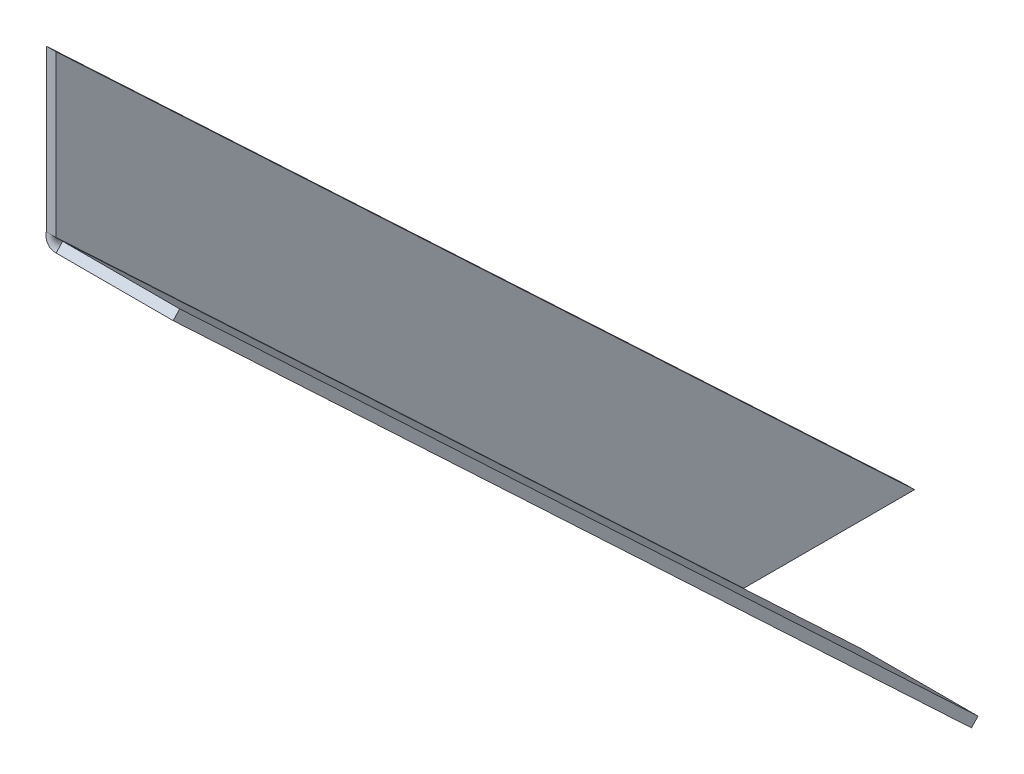
ISO-10303-21;
HEADER;
FILE_DESCRIPTION(('STEP AP214'),'2;1');
FILE_NAME('part.step','',(''),(''),'','','');
FILE_SCHEMA(('AUTOMOTIVE_DESIGN { 1 0 10303 214 1 1 1 1 }'));
ENDSEC;
DATA;
#1=APPLICATION_CONTEXT('core data for automotive mechanical design processes');
#2=APPLICATION_PROTOCOL_DEFINITION('international standard','automotive_design',2000,#1);
#3=PRODUCT_CONTEXT('',#1,'mechanical');
#4=PRODUCT('Part','Part','',(#3));
#5=PRODUCT_RELATED_PRODUCT_CATEGORY('part','',(#4));
#6=PRODUCT_DEFINITION_FORMATION('','',#4);
#7=PRODUCT_DEFINITION_CONTEXT('part definition',#1,'design');
#8=PRODUCT_DEFINITION('design','',#6,#7);
#9=PRODUCT_DEFINITION_SHAPE('','',#8);
#10=(LENGTH_UNIT() NAMED_UNIT(*) SI_UNIT(.MILLI.,.METRE.));
#11=(NAMED_UNIT(*) PLANE_ANGLE_UNIT() SI_UNIT($,.RADIAN.));
#12=(NAMED_UNIT(*) SI_UNIT($,.STERADIAN.) SOLID_ANGLE_UNIT());
#13=UNCERTAINTY_MEASURE_WITH_UNIT(LENGTH_MEASURE(1.E-05),#10,'distance_accuracy_value','');
#14=(GEOMETRIC_REPRESENTATION_CONTEXT(3) GLOBAL_UNCERTAINTY_ASSIGNED_CONTEXT((#13)) GLOBAL_UNIT_ASSIGNED_CONTEXT((#10,
#11,#12)) REPRESENTATION_CONTEXT('',''));
#15=CARTESIAN_POINT('',(0.,0.,0.));
#16=DIRECTION('',(0.,0.,1.));
#17=DIRECTION('',(1.,0.,0.));
#18=AXIS2_PLACEMENT_3D('',#15,#16,#17);
#19=CARTESIAN_POINT('',(472.379455226503,119.946000087051,-20.0000000000002));
#20=DIRECTION('',(0.,0.727987477461999,-0.685590426317721));
#21=DIRECTION('',(-0.685590426317721,0.499101245027136,0.529965767341485));
#22=AXIS2_PLACEMENT_3D('',#19,#20,#21);
#23=PLANE('',#22);
#24=DIRECTION('',(0.,0.685590426317722,0.727987477462));
#25=VECTOR('',#24,1.);
#26=CARTESIAN_POINT('',(-275.,119.946000087052,-20.));
#27=LINE('',#26,#25);
#28=CARTESIAN_POINT('',(-275.,-135.,-290.71191248868));
#29=VERTEX_POINT('',#28);
#30=CARTESIAN_POINT('',(-275.,119.946000087052,-20.));
#31=VERTEX_POINT('',#30);
#32=EDGE_CURVE('E89',#29,#31,#27,.T.);
#33=ORIENTED_EDGE('',*,*,#32,.T.);
#34=DIRECTION('',(-1.,0.,0.));
#35=VECTOR('',#34,1.);
#36=CARTESIAN_POINT('',(472.379455226503,119.946000087051,-20.0000000000002));
#37=LINE('',#36,#35);
#38=CARTESIAN_POINT('',(-272.,119.946000087052,-20.0000000000001));
#39=VERTEX_POINT('',#38);
#40=EDGE_CURVE('E483',#39,#31,#37,.T.);
#41=ORIENTED_EDGE('',*,*,#40,.F.);
#42=DIRECTION('',(0.,-0.685590426317722,-0.727987477462));
#43=VECTOR('',#42,1.);
#44=CARTESIAN_POINT('',(-272.,119.946000087052,-20.));
#45=LINE('',#44,#43);
#46=CARTESIAN_POINT('',(-272.,-135.,-290.71191248868));
#47=VERTEX_POINT('',#46);
#48=EDGE_CURVE('E71',#39,#47,#45,.T.);
#49=ORIENTED_EDGE('',*,*,#48,.T.);
#50=DIRECTION('',(-1.,0.,0.));
#51=VECTOR('',#50,1.);
#52=CARTESIAN_POINT('',(472.379455226503,-135.000000000001,-290.71191248868));
#53=LINE('',#52,#51);
#54=EDGE_CURVE('E477',#47,#29,#53,.T.);
#55=ORIENTED_EDGE('',*,*,#54,.T.);
#56=EDGE_LOOP('',(#33,#41,#49,#55));
#57=FACE_BOUND('',#56,.T.);
#58=ADVANCED_FACE('F48',(#57),#23,.T.);
#59=CARTESIAN_POINT('',(472.379455226503,-135.000000000001,20.0099999999997));
#60=DIRECTION('',(0.,1.,0.));
#61=DIRECTION('',(-0.565458869096416,0.,0.824776495397512));
#62=AXIS2_PLACEMENT_3D('',#59,#60,#61);
#63=PLANE('',#62);
#64=CARTESIAN_POINT('',(-275.,-135.000000000002,-236.889690672966));
#65=CARTESIAN_POINT('',(-272.,-135.,-236.889690672968));
#66=B_SPLINE_CURVE_WITH_KNOTS('',1,(#64,#65),.UNSPECIFIED.,.F.,.F.,(2,2),(0.,1.),.UNSPECIFIED.);
#67=CARTESIAN_POINT('',(-272.,-135.,-236.889690672968));
#68=VERTEX_POINT('',#67);
#69=CARTESIAN_POINT('',(-275.,-135.000000000003,-236.889690672965));
#70=VERTEX_POINT('',#69);
#71=EDGE_CURVE('E492',#68,#70,#66,.F.);
#72=ORIENTED_EDGE('',*,*,#71,.T.);
#73=DIRECTION('',(0.,0.,1.));
#74=VECTOR('',#73,1.);
#75=CARTESIAN_POINT('',(-275.,-135.,19.9999999999999));
#76=LINE('',#75,#74);
#77=EDGE_CURVE('E488',#29,#70,#76,.T.);
#78=ORIENTED_EDGE('',*,*,#77,.F.);
#79=ORIENTED_EDGE('',*,*,#54,.F.);
#80=DIRECTION('',(0.,0.,-1.));
#81=VECTOR('',#80,1.);
#82=CARTESIAN_POINT('',(-272.,-135.,20.01));
#83=LINE('',#82,#81);
#84=EDGE_CURVE('E11',#68,#47,#83,.T.);
#85=ORIENTED_EDGE('',*,*,#84,.F.);
#86=EDGE_LOOP('',(#72,#78,#79,#85));
#87=FACE_BOUND('',#86,.T.);
#88=ADVANCED_FACE('F437',(#87),#63,.F.);
#89=CARTESIAN_POINT('',(-275.,175.,20.));
#90=DIRECTION('',(1.,0.,0.));
#91=DIRECTION('',(0.,1.,0.));
#92=AXIS2_PLACEMENT_3D('',#89,#90,#91);
#93=PLANE('',#92);
#94=ORIENTED_EDGE('',*,*,#77,.T.);
#95=DIRECTION('',(0.,0.685590426317722,0.727987477461999));
#96=VECTOR('',#95,1.);
#97=CARTESIAN_POINT('',(-275.,-135.000000000001,-236.889690672969));
#98=LINE('',#97,#96);
#99=CARTESIAN_POINT('',(-275.,69.2583150067458,-20.));
#100=VERTEX_POINT('',#99);
#101=EDGE_CURVE('E214',#70,#100,#98,.T.);
#102=ORIENTED_EDGE('',*,*,#101,.T.);
#103=DIRECTION('',(0.,-1.,0.));
#104=VECTOR('',#103,1.);
#105=CARTESIAN_POINT('',(-275.,-1.16573417585641E-12,-20.0000000000001));
#106=LINE('',#105,#104);
#107=EDGE_CURVE('E94',#31,#100,#106,.T.);
#108=ORIENTED_EDGE('',*,*,#107,.F.);
#109=ORIENTED_EDGE('',*,*,#32,.F.);
#110=EDGE_LOOP('',(#94,#102,#108,#109));
#111=FACE_BOUND('',#110,.T.);
#112=ADVANCED_FACE('F442',(#111),#93,.F.);
#113=CARTESIAN_POINT('',(472.379455226503,-1.19348975147204E-12,-20.0000000000002));
#114=DIRECTION('',(0.,0.,-1.));
#115=DIRECTION('',(-0.542424166461996,0.840104769441294,0.));
#116=AXIS2_PLACEMENT_3D('',#113,#114,#115);
#117=PLANE('',#116);
#118=ORIENTED_EDGE('',*,*,#40,.T.);
#119=ORIENTED_EDGE('',*,*,#107,.T.);
#120=CARTESIAN_POINT('',(-272.,69.2583150067449,-20.0000000000008));
#121=CARTESIAN_POINT('',(-275.,69.2583150067447,-20.0000000000006));
#122=B_SPLINE_CURVE_WITH_KNOTS('',1,(#120,#121),.UNSPECIFIED.,.F.,.F.,(2,2),(0.,1.),.UNSPECIFIED.);
#123=CARTESIAN_POINT('',(-272.,69.258315006745,-20.0000000000006));
#124=VERTEX_POINT('',#123);
#125=EDGE_CURVE('E399',#124,#100,#122,.T.);
#126=ORIENTED_EDGE('',*,*,#125,.F.);
#127=DIRECTION('',(0.,1.,0.));
#128=VECTOR('',#127,1.);
#129=CARTESIAN_POINT('',(-272.,0.,-20.));
#130=LINE('',#129,#128);
#131=EDGE_CURVE('E459',#39,#124,#130,.F.);
#132=ORIENTED_EDGE('',*,*,#131,.F.);
#133=EDGE_LOOP('',(#118,#119,#126,#132));
#134=FACE_BOUND('',#133,.T.);
#135=ADVANCED_FACE('F470',(#134),#117,.F.);
#136=CARTESIAN_POINT('',(-272.,-135.,-330.));
#137=DIRECTION('',(-1.,0.,0.));
#138=DIRECTION('',(0.,-1.,0.));
#139=AXIS2_PLACEMENT_3D('',#136,#137,#138);
#140=PLANE('',#139);
#141=ORIENTED_EDGE('',*,*,#131,.T.);
#142=DIRECTION('',(0.,-0.685590426317722,-0.727987477461999));
#143=VECTOR('',#142,1.);
#144=CARTESIAN_POINT('',(-272.,-135.,-236.889690672969));
#145=LINE('',#144,#143);
#146=EDGE_CURVE('E60',#124,#68,#145,.T.);
#147=ORIENTED_EDGE('',*,*,#146,.T.);
#148=ORIENTED_EDGE('',*,*,#84,.T.);
#149=ORIENTED_EDGE('',*,*,#48,.F.);
#150=EDGE_LOOP('',(#141,#147,#148,#149));
#151=FACE_BOUND('',#150,.T.);
#152=ADVANCED_FACE('F50',(#151),#140,.F.);
#153=CARTESIAN_POINT('',(116.698245411011,369.003077908803,-711.394420112729));
#154=DIRECTION('',(0.,-0.685590426317721,-0.727987477461999));
#155=DIRECTION('',(0.,0.727987477461999,-0.685590426317721));
#156=AXIS2_PLACEMENT_3D('',#153,#154,#155);
#157=PLANE('',#156);
#158=DIRECTION('',(0.,-0.727987477461999,0.685590426317721));
#159=VECTOR('',#158,1.);
#160=CARTESIAN_POINT('',(-271.600000000001,369.003077908803,-711.394420112729));
#161=LINE('',#160,#159);
#162=CARTESIAN_POINT('',(-271.6,-135.,-236.743830993251));
#163=VERTEX_POINT('',#162);
#164=CARTESIAN_POINT('',(-271.6,-137.183962432386,-234.687059714299));
#165=VERTEX_POINT('',#164);
#166=EDGE_CURVE('E373',#163,#165,#161,.T.);
#167=ORIENTED_EDGE('',*,*,#166,.T.);
#168=DIRECTION('',(1.,0.,0.));
#169=VECTOR('',#168,1.);
#170=CARTESIAN_POINT('',(-272.,-137.183962432386,-234.687059714298));
#171=LINE('',#170,#169);
#172=CARTESIAN_POINT('',(-271.9,-137.183962432386,-234.687059714298));
#173=VERTEX_POINT('',#172);
#174=EDGE_CURVE('E104',#173,#165,#171,.T.);
#175=ORIENTED_EDGE('',*,*,#174,.F.);
#176=DIRECTION('',(0.,-0.727987477461999,0.685590426317721));
#177=VECTOR('',#176,1.);
#178=CARTESIAN_POINT('',(-271.900000000001,369.003077908803,-711.394420112729));
#179=LINE('',#178,#177);
#180=CARTESIAN_POINT('',(-271.9,-135.,-236.743830993251));
#181=VERTEX_POINT('',#180);
#182=EDGE_CURVE('E222',#181,#173,#179,.T.);
#183=ORIENTED_EDGE('',*,*,#182,.F.);
#184=DIRECTION('',(1.,0.,0.));
#185=VECTOR('',#184,1.);
#186=CARTESIAN_POINT('',(116.698245411012,-135.,-236.743830993252));
#187=LINE('',#186,#185);
#188=EDGE_CURVE('E359',#181,#163,#187,.T.);
#189=ORIENTED_EDGE('',*,*,#188,.T.);
#190=EDGE_LOOP('',(#167,#175,#183,#189));
#191=FACE_BOUND('',#190,.T.);
#192=ADVANCED_FACE('F428',(#191),#157,.T.);
#193=CARTESIAN_POINT('',(-7.58047583003592E-13,571.187040341189,-496.70736039843));
#194=DIRECTION('',(0.,0.685590426317721,0.727987477461999));
#195=DIRECTION('',(0.,-0.727987477461999,0.685590426317721));
#196=AXIS2_PLACEMENT_3D('',#193,#194,#195);
#197=PLANE('',#196);
#198=CARTESIAN_POINT('',(-271.9,64.9999999999996,-19.9999999999999));
#199=CARTESIAN_POINT('',(-271.9,67.1839624323854,-22.056771278953));
#200=B_SPLINE_CURVE_WITH_KNOTS('',1,(#198,#199),.UNSPECIFIED.,.F.,.F.,(2,2),(0.,1.),.UNSPECIFIED.);
#201=CARTESIAN_POINT('',(-271.9,67.1839624323856,-22.0567712789529));
#202=VERTEX_POINT('',#201);
#203=CARTESIAN_POINT('',(-271.9,64.9999999999998,-19.9999999999999));
#204=VERTEX_POINT('',#203);
#205=EDGE_CURVE('E326',#202,#204,#200,.F.);
#206=ORIENTED_EDGE('',*,*,#205,.T.);
#207=DIRECTION('',(1.,0.,0.));
#208=VECTOR('',#207,1.);
#209=CARTESIAN_POINT('',(0.,64.9999999999999,-20.));
#210=LINE('',#209,#208);
#211=CARTESIAN_POINT('',(-234.999999999998,64.9999999999999,-20.));
#212=VERTEX_POINT('',#211);
#213=EDGE_CURVE('E349',#212,#204,#210,.F.);
#214=ORIENTED_EDGE('',*,*,#213,.F.);
#215=DIRECTION('',(0.,-0.727987477461999,0.685590426317721));
#216=VECTOR('',#215,1.);
#217=CARTESIAN_POINT('',(-235.000000000001,571.187040341189,-496.70736039843));
#218=LINE('',#217,#216);
#219=CARTESIAN_POINT('',(-235.,67.1839624323855,-22.0567712789529));
#220=VERTEX_POINT('',#219);
#221=EDGE_CURVE('E394',#220,#212,#218,.T.);
#222=ORIENTED_EDGE('',*,*,#221,.F.);
#223=DIRECTION('',(1.,0.,0.));
#224=VECTOR('',#223,1.);
#225=CARTESIAN_POINT('',(0.,67.1839624323857,-22.056771278953));
#226=LINE('',#225,#224);
#227=EDGE_CURVE('E372',#202,#220,#226,.T.);
#228=ORIENTED_EDGE('',*,*,#227,.F.);
#229=EDGE_LOOP('',(#206,#214,#222,#228));
#230=FACE_BOUND('',#229,.T.);
#231=ADVANCED_FACE('F417',(#230),#197,.T.);
#232=CARTESIAN_POINT('',(-235.000000000001,573.124027915332,-494.650589119477));
#233=DIRECTION('',(1.,0.,0.));
#234=DIRECTION('',(0.,1.,0.));
#235=AXIS2_PLACEMENT_3D('',#232,#233,#234);
#236=PLANE('',#235);
#237=ORIENTED_EDGE('',*,*,#221,.T.);
#238=DIRECTION('',(0.,0.685590426317723,0.727987477461998));
#239=VECTOR('',#238,1.);
#240=CARTESIAN_POINT('',(-235.,-172.000000000001,-271.656128113052));
#241=LINE('',#240,#239);
#242=CARTESIAN_POINT('',(-235.,-172.,-271.656128113051));
#243=VERTEX_POINT('',#242);
#244=EDGE_CURVE('E346',#243,#212,#241,.T.);
#245=ORIENTED_EDGE('',*,*,#244,.F.);
#246=DIRECTION('',(0.,-0.727987477461999,0.685590426317721));
#247=VECTOR('',#246,1.);
#248=CARTESIAN_POINT('',(-235.000000000001,334.187040341189,-748.363488511482));
#249=LINE('',#248,#247);
#250=CARTESIAN_POINT('',(-235.,-169.816037567615,-273.712899392004));
#251=VERTEX_POINT('',#250);
#252=EDGE_CURVE('E390',#251,#243,#249,.T.);
#253=ORIENTED_EDGE('',*,*,#252,.F.);
#254=DIRECTION('',(0.,-0.685590426317722,-0.727987477461999));
#255=VECTOR('',#254,1.);
#256=CARTESIAN_POINT('',(-235.,69.1209500065284,-19.9999999999997));
#257=LINE('',#256,#255);
#258=EDGE_CURVE('E115',#251,#220,#257,.F.);
#259=ORIENTED_EDGE('',*,*,#258,.T.);
#260=EDGE_LOOP('',(#237,#245,#253,#259));
#261=FACE_BOUND('',#260,.T.);
#262=ADVANCED_FACE('F427',(#261),#236,.T.);
#263=CARTESIAN_POINT('',(-272.000000000001,334.187040341189,-748.363488511482));
#264=DIRECTION('',(0.,-0.685590426317721,-0.727987477461999));
#265=DIRECTION('',(0.,0.727987477461999,-0.685590426317721));
#266=AXIS2_PLACEMENT_3D('',#263,#264,#265);
#267=PLANE('',#266);
#268=ORIENTED_EDGE('',*,*,#252,.T.);
#269=DIRECTION('',(1.,0.,0.));
#270=VECTOR('',#269,1.);
#271=CARTESIAN_POINT('',(-272.,-172.,-271.656128113052));
#272=LINE('',#271,#270);
#273=CARTESIAN_POINT('',(-272.,-172.000000000001,-271.656128113052));
#274=VERTEX_POINT('',#273);
#275=EDGE_CURVE('E343',#274,#243,#272,.T.);
#276=ORIENTED_EDGE('',*,*,#275,.F.);
#277=DIRECTION('',(0.,-0.727987477461999,0.685590426317721));
#278=VECTOR('',#277,1.);
#279=CARTESIAN_POINT('',(-272.000000000001,334.187040341188,-748.363488511482));
#280=LINE('',#279,#278);
#281=CARTESIAN_POINT('',(-272.,-169.816037567615,-273.712899392005));
#282=VERTEX_POINT('',#281);
#283=EDGE_CURVE('E386',#282,#274,#280,.T.);
#284=ORIENTED_EDGE('',*,*,#283,.F.);
#285=DIRECTION('',(-1.,0.,0.));
#286=VECTOR('',#285,1.);
#287=CARTESIAN_POINT('',(-272.,-169.816037567615,-273.712899392004));
#288=LINE('',#287,#286);
#289=EDGE_CURVE('E366',#251,#282,#288,.T.);
#290=ORIENTED_EDGE('',*,*,#289,.F.);
#291=EDGE_LOOP('',(#268,#276,#284,#290));
#292=FACE_BOUND('',#291,.T.);
#293=ADVANCED_FACE('F508',(#292),#267,.T.);
#294=CARTESIAN_POINT('',(-272.000000000001,573.124027915332,-494.650589119477));
#295=DIRECTION('',(-1.,0.,0.));
#296=DIRECTION('',(0.,-1.,0.));
#297=AXIS2_PLACEMENT_3D('',#294,#295,#296);
#298=PLANE('',#297);
#299=ORIENTED_EDGE('',*,*,#283,.T.);
#300=DIRECTION('',(0.,-0.685590426317723,-0.727987477461998));
#301=VECTOR('',#300,1.);
#302=CARTESIAN_POINT('',(-272.,-135.,-232.36804060173));
#303=LINE('',#302,#301);
#304=CARTESIAN_POINT('',(-272.,-137.389639560281,-234.905455957537));
#305=VERTEX_POINT('',#304);
#306=EDGE_CURVE('E340',#305,#274,#303,.T.);
#307=ORIENTED_EDGE('',*,*,#306,.F.);
#308=DIRECTION('',(0.,-0.727987477461999,0.685590426317721));
#309=VECTOR('',#308,1.);
#310=CARTESIAN_POINT('',(-272.000000000001,368.797400780908,-711.612816355967));
#311=LINE('',#310,#309);
#312=CARTESIAN_POINT('',(-272.,-135.205677127895,-236.96222723649));
#313=VERTEX_POINT('',#312);
#314=EDGE_CURVE('E382',#313,#305,#311,.T.);
#315=ORIENTED_EDGE('',*,*,#314,.F.);
#316=DIRECTION('',(0.,-0.685590426317722,-0.727987477461999));
#317=VECTOR('',#316,1.);
#318=CARTESIAN_POINT('',(-272.,69.1209500065284,-19.9999999999997));
#319=LINE('',#318,#317);
#320=EDGE_CURVE('E363',#313,#282,#319,.T.);
#321=ORIENTED_EDGE('',*,*,#320,.T.);
#322=EDGE_LOOP('',(#299,#307,#315,#321));
#323=FACE_BOUND('',#322,.T.);
#324=ADVANCED_FACE('F584',(#323),#298,.T.);
#325=CARTESIAN_POINT('',(116.698245411011,368.797400780908,-711.612816355968));
#326=DIRECTION('',(0.,0.685590426317721,0.727987477461999));
#327=DIRECTION('',(0.,-0.727987477461999,0.685590426317721));
#328=AXIS2_PLACEMENT_3D('',#325,#326,#327);
#329=PLANE('',#328);
#330=ORIENTED_EDGE('',*,*,#314,.T.);
#331=DIRECTION('',(-1.,0.,0.));
#332=VECTOR('',#331,1.);
#333=CARTESIAN_POINT('',(-272.,-137.389639560281,-234.905455957537));
#334=LINE('',#333,#332);
#335=CARTESIAN_POINT('',(-271.6,-137.389639560281,-234.905455957537));
#336=VERTEX_POINT('',#335);
#337=EDGE_CURVE('E337',#336,#305,#334,.T.);
#338=ORIENTED_EDGE('',*,*,#337,.F.);
#339=DIRECTION('',(0.,-0.727987477461999,0.685590426317721));
#340=VECTOR('',#339,1.);
#341=CARTESIAN_POINT('',(-271.600000000001,368.797400780908,-711.612816355967));
#342=LINE('',#341,#340);
#343=CARTESIAN_POINT('',(-271.6,-135.205677127895,-236.96222723649));
#344=VERTEX_POINT('',#343);
#345=EDGE_CURVE('E377',#344,#336,#342,.T.);
#346=ORIENTED_EDGE('',*,*,#345,.F.);
#347=DIRECTION('',(-1.,0.,0.));
#348=VECTOR('',#347,1.);
#349=CARTESIAN_POINT('',(116.698245411012,-135.205677127895,-236.96222723649));
#350=LINE('',#349,#348);
#351=EDGE_CURVE('E353',#344,#313,#350,.T.);
#352=ORIENTED_EDGE('',*,*,#351,.T.);
#353=EDGE_LOOP('',(#330,#338,#346,#352));
#354=FACE_BOUND('',#353,.T.);
#355=ADVANCED_FACE('F592',(#354),#329,.T.);
#356=CARTESIAN_POINT('',(-271.600000000001,573.124027915332,-494.650589119477));
#357=DIRECTION('',(-1.,0.,0.));
#358=DIRECTION('',(0.,0.,1.));
#359=AXIS2_PLACEMENT_3D('',#356,#357,#358);
#360=PLANE('',#359);
#361=ORIENTED_EDGE('',*,*,#345,.T.);
#362=DIRECTION('',(0.,-0.685590426317722,-0.727987477461999));
#363=VECTOR('',#362,1.);
#364=CARTESIAN_POINT('',(-271.6,64.9999999999998,-20.));
#365=LINE('',#364,#363);
#366=EDGE_CURVE('E204',#165,#336,#365,.T.);
#367=ORIENTED_EDGE('',*,*,#366,.F.);
#368=ORIENTED_EDGE('',*,*,#166,.F.);
#369=DIRECTION('',(0.,-0.685590426317721,-0.727987477461999));
#370=VECTOR('',#369,1.);
#371=CARTESIAN_POINT('',(-271.6,69.1209500065286,-19.9999999999995));
#372=LINE('',#371,#370);
#373=EDGE_CURVE('E356',#163,#344,#372,.T.);
#374=ORIENTED_EDGE('',*,*,#373,.T.);
#375=EDGE_LOOP('',(#361,#367,#368,#374));
#376=FACE_BOUND('',#375,.T.);
#377=ADVANCED_FACE('F606',(#376),#360,.T.);
#378=CARTESIAN_POINT('',(116.698245411012,69.1209500065287,-20.));
#379=DIRECTION('',(0.,-0.727987477461999,0.685590426317722));
#380=DIRECTION('',(0.,-0.685590426317722,-0.727987477461999));
#381=AXIS2_PLACEMENT_3D('',#378,#379,#380);
#382=PLANE('',#381);
#383=DIRECTION('',(0.,-0.685590426317721,-0.727987477461999));
#384=VECTOR('',#383,1.);
#385=CARTESIAN_POINT('',(-271.9,-135.,-236.743830993251));
#386=LINE('',#385,#384);
#387=EDGE_CURVE('E378',#202,#181,#386,.T.);
#388=ORIENTED_EDGE('',*,*,#387,.F.);
#389=ORIENTED_EDGE('',*,*,#227,.T.);
#390=ORIENTED_EDGE('',*,*,#258,.F.);
#391=ORIENTED_EDGE('',*,*,#289,.T.);
#392=ORIENTED_EDGE('',*,*,#320,.F.);
#393=ORIENTED_EDGE('',*,*,#351,.F.);
#394=ORIENTED_EDGE('',*,*,#373,.F.);
#395=ORIENTED_EDGE('',*,*,#188,.F.);
#396=EDGE_LOOP('',(#388,#389,#390,#391,#392,#393,#394,#395));
#397=FACE_BOUND('',#396,.T.);
#398=ADVANCED_FACE('F513',(#397),#382,.F.);
#399=CARTESIAN_POINT('',(-272.,64.9999999999998,-20.));
#400=DIRECTION('',(0.,-0.727987477461999,0.685590426317722));
#401=DIRECTION('',(0.,-0.685590426317722,-0.727987477461999));
#402=AXIS2_PLACEMENT_3D('',#399,#400,#401);
#403=PLANE('',#402);
#404=ORIENTED_EDGE('',*,*,#213,.T.);
#405=DIRECTION('',(0.,-0.685590426317722,-0.727987477461999));
#406=VECTOR('',#405,1.);
#407=CARTESIAN_POINT('',(-271.9,-137.183962432386,-234.687059714298));
#408=LINE('',#407,#406);
#409=EDGE_CURVE('E352',#204,#173,#408,.T.);
#410=ORIENTED_EDGE('',*,*,#409,.T.);
#411=ORIENTED_EDGE('',*,*,#174,.T.);
#412=ORIENTED_EDGE('',*,*,#366,.T.);
#413=ORIENTED_EDGE('',*,*,#337,.T.);
#414=ORIENTED_EDGE('',*,*,#306,.T.);
#415=ORIENTED_EDGE('',*,*,#275,.T.);
#416=ORIENTED_EDGE('',*,*,#244,.T.);
#417=EDGE_LOOP('',(#404,#410,#411,#412,#413,#414,#415,#416));
#418=FACE_BOUND('',#417,.T.);
#419=ADVANCED_FACE('F301',(#418),#403,.T.);
#420=CARTESIAN_POINT('',(-275.,-135.000000000002,-236.889690672966));
#421=CARTESIAN_POINT('',(-275.,-135.123443592465,-236.724814347253));
#422=CARTESIAN_POINT('',(-274.980018784745,-135.246868147847,-236.559962056485));
#423=CARTESIAN_POINT('',(-274.94043436925,-135.367473517598,-236.397758659056));
#424=CARTESIAN_POINT('',(-272.,-135.,-236.889690672968));
#425=CARTESIAN_POINT('',(-272.,-134.980498388325,-236.8594365696));
#426=CARTESIAN_POINT('',(-271.999355393132,-134.960996746945,-236.829182713534));
#427=CARTESIAN_POINT('',(-271.99807852804,-134.941403583394,-236.799014830179));
#428=B_SPLINE_SURFACE_WITH_KNOTS('',1,3,((#420,#421,#422,#423),(#424,#425,#426,#427)),
.UNSPECIFIED.,.F.,.F.,.F.,(2,2),(4,4),(0.,1.),(0.,1.),.UNSPECIFIED.);
#429=CARTESIAN_POINT('',(-272.,-135.,-236.889690672968));
#430=CARTESIAN_POINT('',(-272.,-134.980498388325,-236.8594365696));
#431=CARTESIAN_POINT('',(-271.999355393132,-134.960996746945,-236.829182713534));
#432=CARTESIAN_POINT('',(-271.99807852804,-134.941403583394,-236.799014830179));
#433=B_SPLINE_CURVE_WITH_KNOTS('',3,(#429,#430,#431,#432),.UNSPECIFIED.,.F.,.F.,(4,4),(0.,1.),.UNSPECIFIED.);
#434=CARTESIAN_POINT('',(-271.99807852804,-134.941403583394,-236.799014830179));
#435=VERTEX_POINT('',#434);
#436=EDGE_CURVE('E196',#68,#435,#433,.T.);
#437=CARTESIAN_POINT('',(-271.99807852804,-134.941403583394,-236.799014830179));
#438=CARTESIAN_POINT('',(-274.94043436925,-135.367473517598,-236.397758659056));
#439=B_SPLINE_CURVE_WITH_KNOTS('',1,(#437,#438),.UNSPECIFIED.,.F.,.F.,(2,2),(0.,1.),.UNSPECIFIED.);
#440=CARTESIAN_POINT('',(-274.94043436925,-135.367473517598,-236.397758659056));
#441=VERTEX_POINT('',#440);
#442=EDGE_CURVE('E189',#435,#441,#439,.T.);
#443=CARTESIAN_POINT('',(-274.94043436925,-135.367473517598,-236.397758659056));
#444=CARTESIAN_POINT('',(-274.980018784745,-135.246868147847,-236.559962056485));
#445=CARTESIAN_POINT('',(-275.,-135.123443592465,-236.724814347253));
#446=CARTESIAN_POINT('',(-275.,-135.000000000002,-236.889690672966));
#447=B_SPLINE_CURVE_WITH_KNOTS('',3,(#443,#444,#445,#446),.UNSPECIFIED.,.F.,.F.,(4,4),(0.,1.),.UNSPECIFIED.);
#448=EDGE_CURVE('E193',#70,#441,#447,.F.);
#449=ORIENTED_EDGE('',*,*,#71,.F.);
#450=ORIENTED_EDGE('',*,*,#436,.T.);
#451=ORIENTED_EDGE('',*,*,#442,.T.);
#452=ORIENTED_EDGE('',*,*,#448,.F.);
#453=EDGE_LOOP('',(#449,#450,#451,#452));
#454=FACE_BOUND('',#453,.T.);
#455=ADVANCED_FACE('F192',(#454),#428,.T.);
#456=CARTESIAN_POINT('',(-271.9,-134.927201252254,-236.812390035883));
#457=DIRECTION('',(1.12099052562734E-13,-0.685590426317721,-0.727987477461999));
#458=DIRECTION('',(0.,0.727987477461999,-0.685590426317721));
#459=AXIS2_PLACEMENT_3D('',#456,#457,#458);
#460=PLANE('',#459);
#461=ORIENTED_EDGE('',*,*,#442,.F.);
#462=CARTESIAN_POINT('',(-271.9,-134.927201252254,-236.812390035883));
#463=DIRECTION('',(0.,0.685590426317721,0.727987477461999));
#464=DIRECTION('',(0.,-0.727987477461999,0.685590426317721));
#465=AXIS2_PLACEMENT_3D('',#462,#463,#464);
#466=CIRCLE('',#465,0.0999999999999653);
#467=EDGE_CURVE('E516',#435,#181,#466,.T.);
#468=ORIENTED_EDGE('',*,*,#467,.T.);
#469=ORIENTED_EDGE('',*,*,#182,.T.);
#470=CARTESIAN_POINT('',(-271.9,-134.927201252254,-236.812390035883));
#471=DIRECTION('',(0.,0.685590426317721,0.727987477461999));
#472=DIRECTION('',(0.,-0.727987477461999,0.685590426317721));
#473=AXIS2_PLACEMENT_3D('',#470,#471,#472);
#474=CIRCLE('',#473,3.09999999999974);
#475=EDGE_CURVE('E213',#441,#173,#474,.T.);
#476=ORIENTED_EDGE('',*,*,#475,.F.);
#477=EDGE_LOOP('',(#461,#468,#469,#476));
#478=FACE_BOUND('',#477,.T.);
#479=ADVANCED_FACE('F220',(#478),#460,.T.);
#480=CARTESIAN_POINT('',(-271.9,64.9999999999996,-19.9999999999999));
#481=CARTESIAN_POINT('',(-272.305842868816,65.1668182735383,-19.82286565056));
#482=CARTESIAN_POINT('',(-272.711418441513,65.3923297573528,-19.7010949392024));
#483=CARTESIAN_POINT('',(-273.461218839149,65.9520185880369,-19.5598021752992));
#484=CARTESIAN_POINT('',(-273.805094831922,66.2860848542575,-19.5402198336098));
#485=CARTESIAN_POINT('',(-274.378967211434,67.0374490646391,-19.5794395226675));
#486=CARTESIAN_POINT('',(-274.608737803898,67.4545826333951,-19.6380867510209));
#487=CARTESIAN_POINT('',(-274.919315297671,68.3340202379057,-19.7979210050253));
#488=CARTESIAN_POINT('',(-275.,68.796048206893,-19.8988923639915));
#489=CARTESIAN_POINT('',(-275.,69.2583150067447,-20.0000000000006));
#490=CARTESIAN_POINT('',(-271.9,67.1839624323854,-22.056771278953));
#491=CARTESIAN_POINT('',(-271.913089976202,67.3507586714098,-21.8796603266461));
#492=CARTESIAN_POINT('',(-271.926174788436,67.5194494933667,-21.7043339670588));
#493=CARTESIAN_POINT('',(-271.950361898037,67.8603352341329,-21.3569809228064));
#494=CARTESIAN_POINT('',(-271.961454671997,68.0325271964798,-21.1849516277855));
#495=CARTESIAN_POINT('',(-271.97996668424,68.3795960140103,-20.8434215658867));
#496=CARTESIAN_POINT('',(-271.987378638835,68.5544675667616,-20.6739158053833));
#497=CARTESIAN_POINT('',(-271.997397267667,68.9056677841028,-20.3362765359022));
#498=CARTESIAN_POINT('',(-272.,69.0819894289642,-20.168136589943));
#499=CARTESIAN_POINT('',(-272.,69.2583150067449,-20.0000000000008));
#500=B_SPLINE_SURFACE_WITH_KNOTS('',1,3,((#480,#481,#482,#483,#484,#485,#486,#487,#488,#489),
(#490,#491,#492,#493,#494,#495,#496,#497,#498,#499)),.UNSPECIFIED.,.F.,.F.,.F.,(2,2),(4,2,2,2,
4),(0.,1.),(0.,0.25,0.5,0.75,1.),.UNSPECIFIED.);
#501=CARTESIAN_POINT('',(-271.9,67.1839624323854,-22.056771278953));
#502=CARTESIAN_POINT('',(-271.913089976202,67.3507586714098,-21.8796603266461));
#503=CARTESIAN_POINT('',(-271.926174788436,67.5194494933667,-21.7043339670588));
#504=CARTESIAN_POINT('',(-271.950361898037,67.8603352341329,-21.3569809228064));
#505=CARTESIAN_POINT('',(-271.961454671997,68.0325271964798,-21.1849516277855));
#506=CARTESIAN_POINT('',(-271.97996668424,68.3795960140103,-20.8434215658867));
#507=CARTESIAN_POINT('',(-271.987378638835,68.5544675667616,-20.6739158053833));
#508=CARTESIAN_POINT('',(-271.997397267667,68.9056677841028,-20.3362765359022));
#509=CARTESIAN_POINT('',(-272.,69.0819894289642,-20.168136589943));
#510=CARTESIAN_POINT('',(-272.,69.2583150067449,-20.0000000000008));
#511=B_SPLINE_CURVE_WITH_KNOTS('',3,(#501,#502,#503,#504,#505,#506,#507,#508,#509,#510),
.UNSPECIFIED.,.F.,.F.,(4,2,2,2,4),(0.,0.25,0.5,0.75,1.),.UNSPECIFIED.);
#512=EDGE_CURVE('E224',#202,#124,#511,.T.);
#513=CARTESIAN_POINT('',(-275.,69.2583150067447,-20.0000000000006));
#514=CARTESIAN_POINT('',(-275.,68.796048206893,-19.8988923639915));
#515=CARTESIAN_POINT('',(-274.919315297671,68.3340202379057,-19.7979210050253));
#516=CARTESIAN_POINT('',(-274.608737803898,67.4545826333951,-19.6380867510209));
#517=CARTESIAN_POINT('',(-274.378967211434,67.0374490646391,-19.5794395226675));
#518=CARTESIAN_POINT('',(-273.805094831922,66.2860848542575,-19.5402198336098));
#519=CARTESIAN_POINT('',(-273.461218839149,65.9520185880369,-19.5598021752992));
#520=CARTESIAN_POINT('',(-272.711418441513,65.3923297573528,-19.7010949392024));
#521=CARTESIAN_POINT('',(-272.305842868816,65.1668182735383,-19.82286565056));
#522=CARTESIAN_POINT('',(-271.9,64.9999999999996,-19.9999999999999));
#523=B_SPLINE_CURVE_WITH_KNOTS('',3,(#513,#514,#515,#516,#517,#518,#519,#520,#521,#522),
.UNSPECIFIED.,.F.,.F.,(4,2,2,2,4),(0.,0.25,0.5,0.75,1.),.UNSPECIFIED.);
#524=EDGE_CURVE('E205',#204,#100,#523,.F.);
#525=ORIENTED_EDGE('',*,*,#512,.T.);
#526=ORIENTED_EDGE('',*,*,#125,.T.);
#527=ORIENTED_EDGE('',*,*,#524,.F.);
#528=ORIENTED_EDGE('',*,*,#205,.F.);
#529=EDGE_LOOP('',(#525,#526,#527,#528));
#530=FACE_BOUND('',#529,.T.);
#531=ADVANCED_FACE('F247',(#530),#500,.T.);
#532=CARTESIAN_POINT('',(-271.900000000001,-404.699364870179,-523.267319018025));
#533=DIRECTION('',(0.,0.685590426317721,0.727987477461999));
#534=DIRECTION('',(0.,-0.727987477461999,0.685590426317721));
#535=AXIS2_PLACEMENT_3D('',#532,#533,#534);
#536=CYLINDRICAL_SURFACE('',#535,3.09999999999974);
#537=ORIENTED_EDGE('',*,*,#409,.F.);
#538=ORIENTED_EDGE('',*,*,#524,.T.);
#539=ORIENTED_EDGE('',*,*,#101,.F.);
#540=ORIENTED_EDGE('',*,*,#448,.T.);
#541=ORIENTED_EDGE('',*,*,#475,.T.);
#542=EDGE_LOOP('',(#537,#538,#539,#540,#541));
#543=FACE_BOUND('',#542,.T.);
#544=ADVANCED_FACE('F212',(#543),#536,.T.);
#545=CARTESIAN_POINT('',(-271.900000000001,-404.699364870179,-523.267319018025));
#546=DIRECTION('',(0.,0.685590426317721,0.727987477461999));
#547=DIRECTION('',(0.,-0.727987477461999,0.685590426317721));
#548=AXIS2_PLACEMENT_3D('',#545,#546,#547);
#549=CYLINDRICAL_SURFACE('',#548,0.0999999999999653);
#550=ORIENTED_EDGE('',*,*,#387,.T.);
#551=ORIENTED_EDGE('',*,*,#467,.F.);
#552=ORIENTED_EDGE('',*,*,#436,.F.);
#553=ORIENTED_EDGE('',*,*,#146,.F.);
#554=ORIENTED_EDGE('',*,*,#512,.F.);
#555=EDGE_LOOP('',(#550,#551,#552,#553,#554));
#556=FACE_BOUND('',#555,.T.);
#557=ADVANCED_FACE('F246',(#556),#549,.F.);
#558=CLOSED_SHELL('',(#58,#88,#112,#135,#152,#192,#231,#262,#293,#324,#355,#377,#398,#419,#455,
#479,#531,#544,#557));
#559=MANIFOLD_SOLID_BREP('B2',#558);
#560=ADVANCED_BREP_SHAPE_REPRESENTATION('',(#18,#559),#14);
#561=SHAPE_DEFINITION_REPRESENTATION(#9,#560);
ENDSEC;
END-ISO-10303-21;
